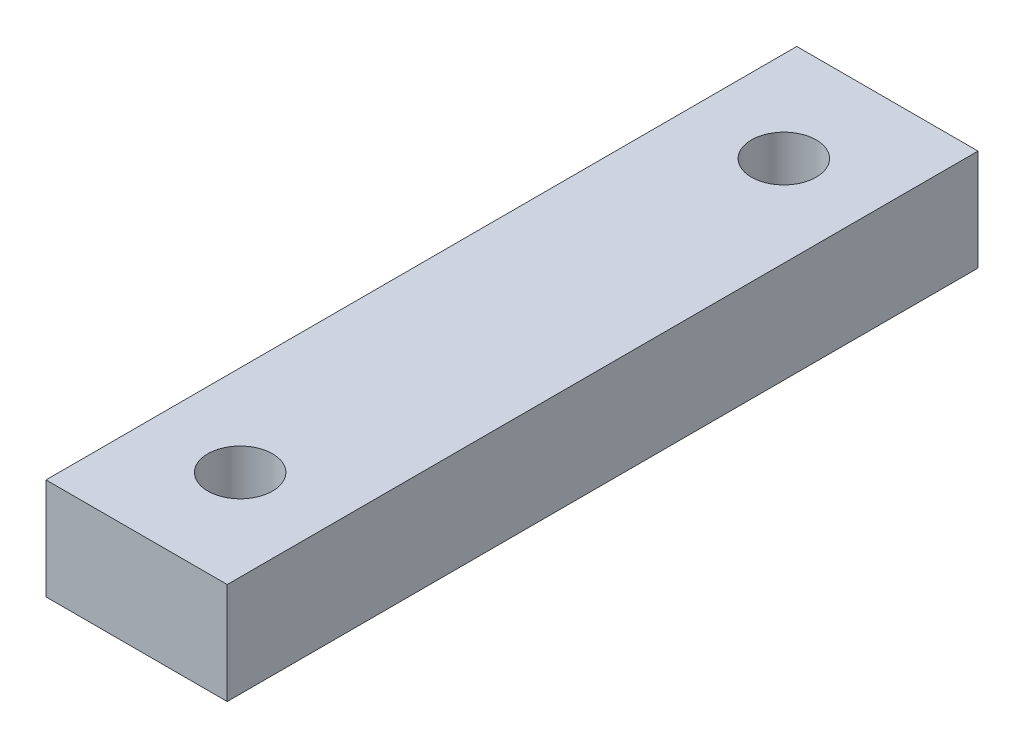
ISO-10303-21;
HEADER;
FILE_DESCRIPTION(('STEP AP214'),'2;1');
FILE_NAME('part.step','',(''),(''),'','','');
FILE_SCHEMA(('AUTOMOTIVE_DESIGN { 1 0 10303 214 1 1 1 1 }'));
ENDSEC;
DATA;
#1=APPLICATION_CONTEXT('core data for automotive mechanical design processes');
#2=APPLICATION_PROTOCOL_DEFINITION('international standard','automotive_design',2000,#1);
#3=PRODUCT_CONTEXT('',#1,'mechanical');
#4=PRODUCT('Part','Part','',(#3));
#5=PRODUCT_RELATED_PRODUCT_CATEGORY('part','',(#4));
#6=PRODUCT_DEFINITION_FORMATION('','',#4);
#7=PRODUCT_DEFINITION_CONTEXT('part definition',#1,'design');
#8=PRODUCT_DEFINITION('design','',#6,#7);
#9=PRODUCT_DEFINITION_SHAPE('','',#8);
#10=(LENGTH_UNIT() NAMED_UNIT(*) SI_UNIT(.MILLI.,.METRE.));
#11=(NAMED_UNIT(*) PLANE_ANGLE_UNIT() SI_UNIT($,.RADIAN.));
#12=(NAMED_UNIT(*) SI_UNIT($,.STERADIAN.) SOLID_ANGLE_UNIT());
#13=UNCERTAINTY_MEASURE_WITH_UNIT(LENGTH_MEASURE(1.E-05),#10,'distance_accuracy_value','');
#14=(GEOMETRIC_REPRESENTATION_CONTEXT(3) GLOBAL_UNCERTAINTY_ASSIGNED_CONTEXT((#13)) GLOBAL_UNIT_ASSIGNED_CONTEXT((#10,
#11,#12)) REPRESENTATION_CONTEXT('',''));
#15=CARTESIAN_POINT('',(0.,0.,0.));
#16=DIRECTION('',(0.,0.,1.));
#17=DIRECTION('',(1.,0.,0.));
#18=AXIS2_PLACEMENT_3D('',#15,#16,#17);
#19=CARTESIAN_POINT('',(0.,7.83,0.));
#20=DIRECTION('',(0.,0.,-1.));
#21=DIRECTION('',(-1.,0.,0.));
#22=AXIS2_PLACEMENT_3D('',#19,#20,#21);
#23=PLANE('',#22);
#24=DIRECTION('',(1.,0.,0.));
#25=VECTOR('',#24,1.);
#26=CARTESIAN_POINT('',(0.,0.,0.));
#27=LINE('',#26,#25);
#28=CARTESIAN_POINT('',(0.,0.,0.));
#29=VERTEX_POINT('',#28);
#30=CARTESIAN_POINT('',(14.,0.,0.));
#31=VERTEX_POINT('',#30);
#32=EDGE_CURVE('E111',#29,#31,#27,.T.);
#33=ORIENTED_EDGE('',*,*,#32,.T.);
#34=DIRECTION('',(0.,-1.,0.));
#35=VECTOR('',#34,1.);
#36=CARTESIAN_POINT('',(14.,7.83,0.));
#37=LINE('',#36,#35);
#38=CARTESIAN_POINT('',(14.,7.83,0.));
#39=VERTEX_POINT('',#38);
#40=EDGE_CURVE('E11',#39,#31,#37,.T.);
#41=ORIENTED_EDGE('',*,*,#40,.F.);
#42=DIRECTION('',(1.,0.,0.));
#43=VECTOR('',#42,1.);
#44=CARTESIAN_POINT('',(0.,7.83,0.));
#45=LINE('',#44,#43);
#46=CARTESIAN_POINT('',(0.,7.83,0.));
#47=VERTEX_POINT('',#46);
#48=EDGE_CURVE('E91',#47,#39,#45,.T.);
#49=ORIENTED_EDGE('',*,*,#48,.F.);
#50=DIRECTION('',(0.,-1.,0.));
#51=VECTOR('',#50,1.);
#52=CARTESIAN_POINT('',(0.,7.83,0.));
#53=LINE('',#52,#51);
#54=EDGE_CURVE('E57',#47,#29,#53,.T.);
#55=ORIENTED_EDGE('',*,*,#54,.T.);
#56=EDGE_LOOP('',(#33,#41,#49,#55));
#57=FACE_BOUND('',#56,.T.);
#58=ADVANCED_FACE('F41',(#57),#23,.F.);
#59=CARTESIAN_POINT('',(14.,7.83,0.));
#60=DIRECTION('',(-1.,0.,0.));
#61=DIRECTION('',(0.,0.,1.));
#62=AXIS2_PLACEMENT_3D('',#59,#60,#61);
#63=PLANE('',#62);
#64=DIRECTION('',(0.,0.,-1.));
#65=VECTOR('',#64,1.);
#66=CARTESIAN_POINT('',(14.,0.,0.));
#67=LINE('',#66,#65);
#68=CARTESIAN_POINT('',(14.,0.,-58.));
#69=VERTEX_POINT('',#68);
#70=EDGE_CURVE('E96',#31,#69,#67,.T.);
#71=ORIENTED_EDGE('',*,*,#70,.T.);
#72=DIRECTION('',(0.,-1.,0.));
#73=VECTOR('',#72,1.);
#74=CARTESIAN_POINT('',(14.,7.83,-58.));
#75=LINE('',#74,#73);
#76=CARTESIAN_POINT('',(14.,7.83,-58.));
#77=VERTEX_POINT('',#76);
#78=EDGE_CURVE('E49',#77,#69,#75,.T.);
#79=ORIENTED_EDGE('',*,*,#78,.F.);
#80=DIRECTION('',(0.,0.,-1.));
#81=VECTOR('',#80,1.);
#82=CARTESIAN_POINT('',(14.,7.83,0.));
#83=LINE('',#82,#81);
#84=EDGE_CURVE('E82',#39,#77,#83,.T.);
#85=ORIENTED_EDGE('',*,*,#84,.F.);
#86=ORIENTED_EDGE('',*,*,#40,.T.);
#87=EDGE_LOOP('',(#71,#79,#85,#86));
#88=FACE_BOUND('',#87,.T.);
#89=ADVANCED_FACE('F95',(#88),#63,.F.);
#90=CARTESIAN_POINT('',(0.,7.83,-58.));
#91=DIRECTION('',(0.,0.,-1.));
#92=DIRECTION('',(-1.,0.,0.));
#93=AXIS2_PLACEMENT_3D('',#90,#91,#92);
#94=PLANE('',#93);
#95=DIRECTION('',(1.,0.,0.));
#96=VECTOR('',#95,1.);
#97=CARTESIAN_POINT('',(0.,0.,-58.));
#98=LINE('',#97,#96);
#99=CARTESIAN_POINT('',(0.,0.,-58.));
#100=VERTEX_POINT('',#99);
#101=EDGE_CURVE('E114',#100,#69,#98,.T.);
#102=ORIENTED_EDGE('',*,*,#101,.F.);
#103=DIRECTION('',(0.,-1.,0.));
#104=VECTOR('',#103,1.);
#105=CARTESIAN_POINT('',(0.,7.83,-58.));
#106=LINE('',#105,#104);
#107=CARTESIAN_POINT('',(0.,7.83,-58.));
#108=VERTEX_POINT('',#107);
#109=EDGE_CURVE('E71',#108,#100,#106,.T.);
#110=ORIENTED_EDGE('',*,*,#109,.F.);
#111=DIRECTION('',(1.,0.,0.));
#112=VECTOR('',#111,1.);
#113=CARTESIAN_POINT('',(0.,7.83,-58.));
#114=LINE('',#113,#112);
#115=EDGE_CURVE('E90',#108,#77,#114,.T.);
#116=ORIENTED_EDGE('',*,*,#115,.T.);
#117=ORIENTED_EDGE('',*,*,#78,.T.);
#118=EDGE_LOOP('',(#102,#110,#116,#117));
#119=FACE_BOUND('',#118,.T.);
#120=ADVANCED_FACE('F99',(#119),#94,.T.);
#121=CARTESIAN_POINT('',(7.,7.83,-50.));
#122=DIRECTION('',(0.,-1.,0.));
#123=DIRECTION('',(0.,0.,-1.));
#124=AXIS2_PLACEMENT_3D('',#121,#122,#123);
#125=CYLINDRICAL_SURFACE('',#124,2.5);
#126=CARTESIAN_POINT('',(7.,7.83,-50.));
#127=DIRECTION('',(0.,1.,0.));
#128=DIRECTION('',(0.,0.,1.));
#129=AXIS2_PLACEMENT_3D('',#126,#127,#128);
#130=CIRCLE('',#129,2.5);
#131=CARTESIAN_POINT('',(7.,7.83,-47.5));
#132=VERTEX_POINT('',#131);
#133=EDGE_CURVE('E102',#132,#132,#130,.T.);
#134=ORIENTED_EDGE('',*,*,#133,.T.);
#135=EDGE_LOOP('',(#134));
#136=FACE_BOUND('',#135,.T.);
#137=CARTESIAN_POINT('',(7.,0.,-50.));
#138=DIRECTION('',(0.,1.,0.));
#139=DIRECTION('',(0.,0.,1.));
#140=AXIS2_PLACEMENT_3D('',#137,#138,#139);
#141=CIRCLE('',#140,2.5);
#142=CARTESIAN_POINT('',(7.,0.,-47.5));
#143=VERTEX_POINT('',#142);
#144=EDGE_CURVE('E119',#143,#143,#141,.T.);
#145=ORIENTED_EDGE('',*,*,#144,.F.);
#146=EDGE_LOOP('',(#145));
#147=FACE_BOUND('',#146,.T.);
#148=ADVANCED_FACE('F146',(#136,#147),#125,.F.);
#149=CARTESIAN_POINT('',(0.,7.83,0.));
#150=DIRECTION('',(-1.,0.,0.));
#151=DIRECTION('',(0.,0.,1.));
#152=AXIS2_PLACEMENT_3D('',#149,#150,#151);
#153=PLANE('',#152);
#154=DIRECTION('',(0.,0.,-1.));
#155=VECTOR('',#154,1.);
#156=CARTESIAN_POINT('',(0.,0.,0.));
#157=LINE('',#156,#155);
#158=EDGE_CURVE('E116',#29,#100,#157,.T.);
#159=ORIENTED_EDGE('',*,*,#158,.F.);
#160=ORIENTED_EDGE('',*,*,#54,.F.);
#161=DIRECTION('',(0.,0.,-1.));
#162=VECTOR('',#161,1.);
#163=CARTESIAN_POINT('',(0.,7.83,0.));
#164=LINE('',#163,#162);
#165=EDGE_CURVE('E100',#47,#108,#164,.T.);
#166=ORIENTED_EDGE('',*,*,#165,.T.);
#167=ORIENTED_EDGE('',*,*,#109,.T.);
#168=EDGE_LOOP('',(#159,#160,#166,#167));
#169=FACE_BOUND('',#168,.T.);
#170=ADVANCED_FACE('F144',(#169),#153,.T.);
#171=CARTESIAN_POINT('',(7.,7.83,-8.));
#172=DIRECTION('',(0.,-1.,0.));
#173=DIRECTION('',(0.,0.,-1.));
#174=AXIS2_PLACEMENT_3D('',#171,#172,#173);
#175=CYLINDRICAL_SURFACE('',#174,2.5);
#176=CARTESIAN_POINT('',(7.,7.83,-8.));
#177=DIRECTION('',(0.,1.,0.));
#178=DIRECTION('',(0.,0.,1.));
#179=AXIS2_PLACEMENT_3D('',#176,#177,#178);
#180=CIRCLE('',#179,2.5);
#181=CARTESIAN_POINT('',(7.,7.83,-5.5));
#182=VERTEX_POINT('',#181);
#183=EDGE_CURVE('E108',#182,#182,#180,.F.);
#184=ORIENTED_EDGE('',*,*,#183,.F.);
#185=EDGE_LOOP('',(#184));
#186=FACE_BOUND('',#185,.T.);
#187=CARTESIAN_POINT('',(7.,0.,-8.));
#188=DIRECTION('',(0.,1.,0.));
#189=DIRECTION('',(0.,0.,1.));
#190=AXIS2_PLACEMENT_3D('',#187,#188,#189);
#191=CIRCLE('',#190,2.5);
#192=CARTESIAN_POINT('',(7.,0.,-5.5));
#193=VERTEX_POINT('',#192);
#194=EDGE_CURVE('E122',#193,#193,#191,.F.);
#195=ORIENTED_EDGE('',*,*,#194,.T.);
#196=EDGE_LOOP('',(#195));
#197=FACE_BOUND('',#196,.T.);
#198=ADVANCED_FACE('F128',(#186,#197),#175,.F.);
#199=CARTESIAN_POINT('',(0.,7.83,0.));
#200=DIRECTION('',(0.,1.,0.));
#201=DIRECTION('',(0.,0.,1.));
#202=AXIS2_PLACEMENT_3D('',#199,#200,#201);
#203=PLANE('',#202);
#204=ORIENTED_EDGE('',*,*,#48,.T.);
#205=ORIENTED_EDGE('',*,*,#84,.T.);
#206=ORIENTED_EDGE('',*,*,#115,.F.);
#207=ORIENTED_EDGE('',*,*,#165,.F.);
#208=EDGE_LOOP('',(#204,#205,#206,#207));
#209=FACE_BOUND('',#208,.T.);
#210=ORIENTED_EDGE('',*,*,#133,.F.);
#211=EDGE_LOOP('',(#210));
#212=FACE_BOUND('',#211,.T.);
#213=ORIENTED_EDGE('',*,*,#183,.T.);
#214=EDGE_LOOP('',(#213));
#215=FACE_BOUND('',#214,.T.);
#216=ADVANCED_FACE('F86',(#209,#212,#215),#203,.T.);
#217=CARTESIAN_POINT('',(0.,0.,0.));
#218=DIRECTION('',(0.,1.,0.));
#219=DIRECTION('',(0.,0.,1.));
#220=AXIS2_PLACEMENT_3D('',#217,#218,#219);
#221=PLANE('',#220);
#222=ORIENTED_EDGE('',*,*,#32,.F.);
#223=ORIENTED_EDGE('',*,*,#158,.T.);
#224=ORIENTED_EDGE('',*,*,#101,.T.);
#225=ORIENTED_EDGE('',*,*,#70,.F.);
#226=EDGE_LOOP('',(#222,#223,#224,#225));
#227=FACE_BOUND('',#226,.T.);
#228=ORIENTED_EDGE('',*,*,#144,.T.);
#229=EDGE_LOOP('',(#228));
#230=FACE_BOUND('',#229,.T.);
#231=ORIENTED_EDGE('',*,*,#194,.F.);
#232=EDGE_LOOP('',(#231));
#233=FACE_BOUND('',#232,.T.);
#234=ADVANCED_FACE('F130',(#227,#230,#233),#221,.F.);
#235=CLOSED_SHELL('',(#58,#89,#120,#148,#170,#198,#216,#234));
#236=MANIFOLD_SOLID_BREP('B2',#235);
#237=ADVANCED_BREP_SHAPE_REPRESENTATION('',(#18,#236),#14);
#238=SHAPE_DEFINITION_REPRESENTATION(#9,#237);
ENDSEC;
END-ISO-10303-21;
